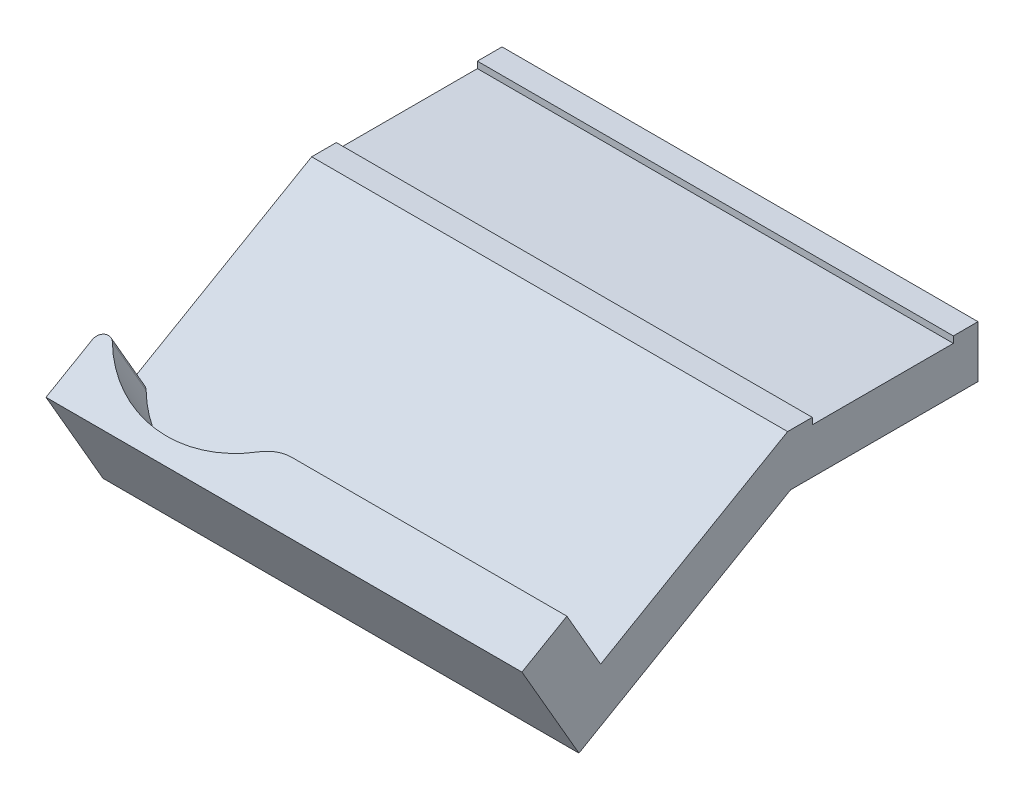
ISO-10303-21;
HEADER;
FILE_DESCRIPTION(('STEP AP214'),'2;1');
FILE_NAME('part.step','',(''),(''),'','','');
FILE_SCHEMA(('AUTOMOTIVE_DESIGN { 1 0 10303 214 1 1 1 1 }'));
ENDSEC;
DATA;
#1=APPLICATION_CONTEXT('core data for automotive mechanical design processes');
#2=APPLICATION_PROTOCOL_DEFINITION('international standard','automotive_design',2000,#1);
#3=PRODUCT_CONTEXT('',#1,'mechanical');
#4=PRODUCT('Part','Part','',(#3));
#5=PRODUCT_RELATED_PRODUCT_CATEGORY('part','',(#4));
#6=PRODUCT_DEFINITION_FORMATION('','',#4);
#7=PRODUCT_DEFINITION_CONTEXT('part definition',#1,'design');
#8=PRODUCT_DEFINITION('design','',#6,#7);
#9=PRODUCT_DEFINITION_SHAPE('','',#8);
#10=(LENGTH_UNIT() NAMED_UNIT(*) SI_UNIT(.MILLI.,.METRE.));
#11=(NAMED_UNIT(*) PLANE_ANGLE_UNIT() SI_UNIT($,.RADIAN.));
#12=(NAMED_UNIT(*) SI_UNIT($,.STERADIAN.) SOLID_ANGLE_UNIT());
#13=UNCERTAINTY_MEASURE_WITH_UNIT(LENGTH_MEASURE(1.E-05),#10,'distance_accuracy_value','');
#14=(GEOMETRIC_REPRESENTATION_CONTEXT(3) GLOBAL_UNCERTAINTY_ASSIGNED_CONTEXT((#13)) GLOBAL_UNIT_ASSIGNED_CONTEXT((#10,
#11,#12)) REPRESENTATION_CONTEXT('',''));
#15=CARTESIAN_POINT('',(0.,0.,0.));
#16=DIRECTION('',(0.,0.,1.));
#17=DIRECTION('',(1.,0.,0.));
#18=AXIS2_PLACEMENT_3D('',#15,#16,#17);
#19=CARTESIAN_POINT('',(55.,23.2790561913612,-51.4));
#20=DIRECTION('',(0.,-1.,0.));
#21=DIRECTION('',(0.,0.,-1.));
#22=AXIS2_PLACEMENT_3D('',#19,#20,#21);
#23=PLANE('',#22);
#24=DIRECTION('',(0.,0.,1.));
#25=VECTOR('',#24,1.);
#26=CARTESIAN_POINT('',(0.,23.2790561913612,-51.4));
#27=LINE('',#26,#25);
#28=CARTESIAN_POINT('',(0.,23.2790561913612,-51.4));
#29=VERTEX_POINT('',#28);
#30=CARTESIAN_POINT('',(0.,23.2790561913612,-48.55));
#31=VERTEX_POINT('',#30);
#32=EDGE_CURVE('E217',#29,#31,#27,.T.);
#33=ORIENTED_EDGE('',*,*,#32,.T.);
#34=DIRECTION('',(-1.,0.,0.));
#35=VECTOR('',#34,1.);
#36=CARTESIAN_POINT('',(0.,23.2790561913612,-48.55));
#37=LINE('',#36,#35);
#38=CARTESIAN_POINT('',(55.,23.2790561913612,-48.55));
#39=VERTEX_POINT('',#38);
#40=EDGE_CURVE('E181',#39,#31,#37,.T.);
#41=ORIENTED_EDGE('',*,*,#40,.F.);
#42=DIRECTION('',(0.,0.,1.));
#43=VECTOR('',#42,1.);
#44=CARTESIAN_POINT('',(55.,23.2790561913612,-51.4));
#45=LINE('',#44,#43);
#46=CARTESIAN_POINT('',(55.,23.2790561913612,-51.4));
#47=VERTEX_POINT('',#46);
#48=EDGE_CURVE('E213',#47,#39,#45,.T.);
#49=ORIENTED_EDGE('',*,*,#48,.F.);
#50=DIRECTION('',(1.,0.,0.));
#51=VECTOR('',#50,1.);
#52=CARTESIAN_POINT('',(55.,23.2790561913612,-51.4));
#53=LINE('',#52,#51);
#54=EDGE_CURVE('E210',#29,#47,#53,.T.);
#55=ORIENTED_EDGE('',*,*,#54,.F.);
#56=EDGE_LOOP('',(#33,#41,#49,#55));
#57=FACE_BOUND('',#56,.T.);
#58=ADVANCED_FACE('F35',(#57),#23,.F.);
#59=CARTESIAN_POINT('',(0.,50.,-33.9));
#60=DIRECTION('',(1.,0.,0.));
#61=DIRECTION('',(0.,0.,-1.));
#62=AXIS2_PLACEMENT_3D('',#59,#60,#61);
#63=PLANE('',#62);
#64=DIRECTION('',(0.,0.,1.));
#65=VECTOR('',#64,1.);
#66=CARTESIAN_POINT('',(0.,22.5290561913612,-48.55));
#67=LINE('',#66,#65);
#68=CARTESIAN_POINT('',(0.,22.5290561913612,-48.55));
#69=VERTEX_POINT('',#68);
#70=CARTESIAN_POINT('',(0.,22.5290561913612,-32.25));
#71=VERTEX_POINT('',#70);
#72=EDGE_CURVE('E177',#69,#71,#67,.T.);
#73=ORIENTED_EDGE('',*,*,#72,.F.);
#74=DIRECTION('',(0.,1.,0.));
#75=VECTOR('',#74,1.);
#76=CARTESIAN_POINT('',(0.,22.5290561913612,-48.55));
#77=LINE('',#76,#75);
#78=EDGE_CURVE('E191',#69,#31,#77,.T.);
#79=ORIENTED_EDGE('',*,*,#78,.T.);
#80=ORIENTED_EDGE('',*,*,#32,.F.);
#81=DIRECTION('',(0.,1.,0.));
#82=VECTOR('',#81,1.);
#83=CARTESIAN_POINT('',(0.,23.2790561913612,-51.4));
#84=LINE('',#83,#82);
#85=CARTESIAN_POINT('',(0.,17.2790561913612,-51.4));
#86=VERTEX_POINT('',#85);
#87=EDGE_CURVE('E208',#86,#29,#84,.T.);
#88=ORIENTED_EDGE('',*,*,#87,.F.);
#89=DIRECTION('',(0.,0.,1.));
#90=VECTOR('',#89,1.);
#91=CARTESIAN_POINT('',(0.,17.2790561913612,-51.4));
#92=LINE('',#91,#90);
#93=CARTESIAN_POINT('',(0.,17.2790561913612,-29.7464101615138));
#94=VERTEX_POINT('',#93);
#95=EDGE_CURVE('E220',#86,#94,#92,.T.);
#96=ORIENTED_EDGE('',*,*,#95,.T.);
#97=DIRECTION('',(0.,-0.5,0.866025403784438));
#98=VECTOR('',#97,1.);
#99=CARTESIAN_POINT('',(0.,17.0790561913612,-29.4));
#100=LINE('',#99,#98);
#101=CARTESIAN_POINT('',(0.,3.15662432702582,-5.28564064605523));
#102=VERTEX_POINT('',#101);
#103=EDGE_CURVE('E221',#94,#102,#100,.T.);
#104=ORIENTED_EDGE('',*,*,#103,.T.);
#105=DIRECTION('',(0.,0.866025403784439,0.5));
#106=VECTOR('',#105,1.);
#107=CARTESIAN_POINT('',(0.,14.5616224765447,1.29903810567667));
#108=LINE('',#107,#106);
#109=CARTESIAN_POINT('',(0.,14.5616224765447,1.29903810567667));
#110=VERTEX_POINT('',#109);
#111=EDGE_CURVE('E173',#102,#110,#108,.T.);
#112=ORIENTED_EDGE('',*,*,#111,.T.);
#113=DIRECTION('',(0.,0.500000000000001,-0.866025403784438));
#114=VECTOR('',#113,1.);
#115=CARTESIAN_POINT('',(0.,11.7549981495187,6.16025403784437));
#116=LINE('',#115,#114);
#117=CARTESIAN_POINT('',(0.,17.6483114747863,-4.04726406644169));
#118=VERTEX_POINT('',#117);
#119=EDGE_CURVE('E156',#110,#118,#116,.T.);
#120=ORIENTED_EDGE('',*,*,#119,.T.);
#121=DIRECTION('',(0.,0.866025403784442,0.499999999999995));
#122=VECTOR('',#121,1.);
#123=CARTESIAN_POINT('',(0.,10.8933133252676,-7.94726406644171));
#124=LINE('',#123,#122);
#125=CARTESIAN_POINT('',(0.,10.8933133252675,-7.9472640664417));
#126=VERTEX_POINT('',#125);
#127=EDGE_CURVE('E248',#118,#126,#124,.F.);
#128=ORIENTED_EDGE('',*,*,#127,.T.);
#129=DIRECTION('',(0.,-0.499999999999995,0.866025403784442));
#130=VECTOR('',#129,1.);
#131=CARTESIAN_POINT('',(0.,31.9078493020357,-44.3455080756888));
#132=LINE('',#131,#130);
#133=CARTESIAN_POINT('',(0.,23.2790561913612,-29.4));
#134=VERTEX_POINT('',#133);
#135=EDGE_CURVE('E231',#134,#126,#132,.T.);
#136=ORIENTED_EDGE('',*,*,#135,.F.);
#137=CARTESIAN_POINT('',(0.,23.2790561913612,-32.25));
#138=VERTEX_POINT('',#137);
#139=EDGE_CURVE('E216',#138,#134,#27,.T.);
#140=ORIENTED_EDGE('',*,*,#139,.F.);
#141=DIRECTION('',(0.,1.,0.));
#142=VECTOR('',#141,1.);
#143=CARTESIAN_POINT('',(0.,22.5290561913612,-32.25));
#144=LINE('',#143,#142);
#145=EDGE_CURVE('E52',#71,#138,#144,.T.);
#146=ORIENTED_EDGE('',*,*,#145,.F.);
#147=EDGE_LOOP('',(#73,#79,#80,#88,#96,#104,#112,#120,#128,#136,#140,#146));
#148=FACE_BOUND('',#147,.T.);
#149=ADVANCED_FACE('F273',(#148),#63,.F.);
#150=CARTESIAN_POINT('',(55.,50.,-33.9));
#151=DIRECTION('',(1.,0.,0.));
#152=DIRECTION('',(0.,0.,-1.));
#153=AXIS2_PLACEMENT_3D('',#150,#151,#152);
#154=PLANE('',#153);
#155=DIRECTION('',(0.,1.,0.));
#156=VECTOR('',#155,1.);
#157=CARTESIAN_POINT('',(55.,22.5290561913612,-48.55));
#158=LINE('',#157,#156);
#159=CARTESIAN_POINT('',(55.,22.5290561913612,-48.55));
#160=VERTEX_POINT('',#159);
#161=EDGE_CURVE('E195',#160,#39,#158,.T.);
#162=ORIENTED_EDGE('',*,*,#161,.F.);
#163=DIRECTION('',(0.,0.,-1.));
#164=VECTOR('',#163,1.);
#165=CARTESIAN_POINT('',(55.,22.5290561913612,-48.55));
#166=LINE('',#165,#164);
#167=CARTESIAN_POINT('',(55.,22.5290561913612,-32.25));
#168=VERTEX_POINT('',#167);
#169=EDGE_CURVE('E184',#168,#160,#166,.T.);
#170=ORIENTED_EDGE('',*,*,#169,.F.);
#171=DIRECTION('',(0.,1.,0.));
#172=VECTOR('',#171,1.);
#173=CARTESIAN_POINT('',(55.,22.5290561913612,-32.25));
#174=LINE('',#173,#172);
#175=CARTESIAN_POINT('',(55.,23.2790561913612,-32.25));
#176=VERTEX_POINT('',#175);
#177=EDGE_CURVE('E197',#168,#176,#174,.T.);
#178=ORIENTED_EDGE('',*,*,#177,.T.);
#179=CARTESIAN_POINT('',(55.,23.2790561913612,-29.4));
#180=VERTEX_POINT('',#179);
#181=EDGE_CURVE('E212',#176,#180,#45,.T.);
#182=ORIENTED_EDGE('',*,*,#181,.T.);
#183=DIRECTION('',(0.,0.499999999999995,-0.866025403784441));
#184=VECTOR('',#183,1.);
#185=CARTESIAN_POINT('',(55.,10.,-6.4));
#186=LINE('',#185,#184);
#187=CARTESIAN_POINT('',(55.,10.805,-7.79430090009301));
#188=VERTEX_POINT('',#187);
#189=EDGE_CURVE('E239',#188,#180,#186,.T.);
#190=ORIENTED_EDGE('',*,*,#189,.F.);
#191=DIRECTION('',(0.,0.866025403784439,0.5));
#192=VECTOR('',#191,1.);
#193=CARTESIAN_POINT('',(55.,10.805,-7.79430090009301));
#194=LINE('',#193,#192);
#195=CARTESIAN_POINT('',(55.,17.5599981495188,-3.89430090009295));
#196=VERTEX_POINT('',#195);
#197=EDGE_CURVE('E153',#188,#196,#194,.T.);
#198=ORIENTED_EDGE('',*,*,#197,.T.);
#199=DIRECTION('',(0.,0.500000000000001,-0.866025403784438));
#200=VECTOR('',#199,1.);
#201=CARTESIAN_POINT('',(55.,11.7549981495187,6.16025403784437));
#202=LINE('',#201,#200);
#203=CARTESIAN_POINT('',(55.,14.5616224765447,1.29903810567666));
#204=VERTEX_POINT('',#203);
#205=EDGE_CURVE('E145',#204,#196,#202,.T.);
#206=ORIENTED_EDGE('',*,*,#205,.F.);
#207=DIRECTION('',(0.,-0.866025403784439,-0.5));
#208=VECTOR('',#207,1.);
#209=CARTESIAN_POINT('',(55.,14.5616224765447,1.29903810567666));
#210=LINE('',#209,#208);
#211=CARTESIAN_POINT('',(55.,3.15662432702582,-5.28564064605524));
#212=VERTEX_POINT('',#211);
#213=EDGE_CURVE('E150',#204,#212,#210,.T.);
#214=ORIENTED_EDGE('',*,*,#213,.T.);
#215=DIRECTION('',(0.,-0.5,0.866025403784438));
#216=VECTOR('',#215,1.);
#217=CARTESIAN_POINT('',(55.,17.0790561913612,-29.4));
#218=LINE('',#217,#216);
#219=CARTESIAN_POINT('',(55.,17.2790561913612,-29.7464101615138));
#220=VERTEX_POINT('',#219);
#221=EDGE_CURVE('E224',#220,#212,#218,.T.);
#222=ORIENTED_EDGE('',*,*,#221,.F.);
#223=DIRECTION('',(0.,0.,1.));
#224=VECTOR('',#223,1.);
#225=CARTESIAN_POINT('',(55.,17.2790561913612,-51.4));
#226=LINE('',#225,#224);
#227=CARTESIAN_POINT('',(55.,17.2790561913612,-51.4));
#228=VERTEX_POINT('',#227);
#229=EDGE_CURVE('E226',#228,#220,#226,.T.);
#230=ORIENTED_EDGE('',*,*,#229,.F.);
#231=DIRECTION('',(0.,-1.,0.));
#232=VECTOR('',#231,1.);
#233=CARTESIAN_POINT('',(55.,23.2790561913612,-51.4));
#234=LINE('',#233,#232);
#235=EDGE_CURVE('E203',#47,#228,#234,.T.);
#236=ORIENTED_EDGE('',*,*,#235,.F.);
#237=ORIENTED_EDGE('',*,*,#48,.T.);
#238=EDGE_LOOP('',(#162,#170,#178,#182,#190,#198,#206,#214,#222,#230,#236,#237));
#239=FACE_BOUND('',#238,.T.);
#240=ADVANCED_FACE('F148',(#239),#154,.T.);
#241=CARTESIAN_POINT('',(5.,10.,-6.4));
#242=DIRECTION('',(0.,-0.866025403784442,-0.499999999999995));
#243=DIRECTION('',(0.,0.499999999999995,-0.866025403784442));
#244=AXIS2_PLACEMENT_3D('',#241,#242,#243);
#245=PLANE('',#244);
#246=ORIENTED_EDGE('',*,*,#189,.T.);
#247=DIRECTION('',(1.,0.,0.));
#248=VECTOR('',#247,1.);
#249=CARTESIAN_POINT('',(0.,23.2790561913612,-29.4));
#250=LINE('',#249,#248);
#251=EDGE_CURVE('E223',#134,#180,#250,.T.);
#252=ORIENTED_EDGE('',*,*,#251,.F.);
#253=ORIENTED_EDGE('',*,*,#135,.T.);
#254=CARTESIAN_POINT('',(1.,10.8933133252676,-7.94726406644171));
#255=DIRECTION('',(0.,-0.866025403784442,-0.499999999999995));
#256=DIRECTION('',(0.,0.499999999999995,-0.866025403784442));
#257=AXIS2_PLACEMENT_3D('',#254,#255,#256);
#258=CIRCLE('',#257,1.);
#259=CARTESIAN_POINT('',(1.7457627118644,11.2264191558952,-8.5242202893863));
#260=VERTEX_POINT('',#259);
#261=EDGE_CURVE('E251',#126,#260,#258,.T.);
#262=ORIENTED_EDGE('',*,*,#261,.T.);
#263=CARTESIAN_POINT('',(12.,15.8066243270259,-16.4573683548744));
#264=DIRECTION('',(0.,0.866025403784442,0.499999999999995));
#265=DIRECTION('',(0.,-0.499999999999995,0.866025403784442));
#266=AXIS2_PLACEMENT_3D('',#263,#264,#265);
#267=CIRCLE('',#266,13.75);
#268=CARTESIAN_POINT('',(20.2468225824083,10.3054331538735,-6.92902574082495));
#269=VERTEX_POINT('',#268);
#270=EDGE_CURVE('E229',#260,#269,#267,.T.);
#271=ORIENTED_EDGE('',*,*,#270,.T.);
#272=CARTESIAN_POINT('',(23.2456671578295,8.30499999999994,-3.46417388117061));
#273=DIRECTION('',(0.,-0.866025403784442,-0.499999999999995));
#274=DIRECTION('',(0.,0.499999999999995,-0.866025403784442));
#275=AXIS2_PLACEMENT_3D('',#272,#273,#274);
#276=CIRCLE('',#275,5.);
#277=CARTESIAN_POINT('',(23.2456671578295,10.805,-7.79430090009301));
#278=VERTEX_POINT('',#277);
#279=EDGE_CURVE('E11',#269,#278,#276,.T.);
#280=ORIENTED_EDGE('',*,*,#279,.T.);
#281=DIRECTION('',(1.,0.,0.));
#282=VECTOR('',#281,1.);
#283=CARTESIAN_POINT('',(0.,10.805,-7.79430090009301));
#284=LINE('',#283,#282);
#285=EDGE_CURVE('E236',#278,#188,#284,.T.);
#286=ORIENTED_EDGE('',*,*,#285,.T.);
#287=EDGE_LOOP('',(#246,#252,#253,#262,#271,#280,#286));
#288=FACE_BOUND('',#287,.T.);
#289=ADVANCED_FACE('F295',(#288),#245,.F.);
#290=CARTESIAN_POINT('',(0.,10.805,-7.79430090009301));
#291=DIRECTION('',(0.,0.5,-0.866025403784439));
#292=DIRECTION('',(0.,0.866025403784439,0.5));
#293=AXIS2_PLACEMENT_3D('',#290,#291,#292);
#294=PLANE('',#293);
#295=ORIENTED_EDGE('',*,*,#285,.F.);
#296=DIRECTION('',(0.,-0.866025403784439,-0.5));
#297=VECTOR('',#296,1.);
#298=CARTESIAN_POINT('',(23.2456671578295,10.805,-7.79430090009301));
#299=LINE('',#298,#297);
#300=CARTESIAN_POINT('',(23.2456671578295,17.5599981495188,-3.89430090009295));
#301=VERTEX_POINT('',#300);
#302=EDGE_CURVE('E253',#278,#301,#299,.F.);
#303=ORIENTED_EDGE('',*,*,#302,.T.);
#304=DIRECTION('',(1.,0.,0.));
#305=VECTOR('',#304,1.);
#306=CARTESIAN_POINT('',(0.,17.5599981495188,-3.89430090009295));
#307=LINE('',#306,#305);
#308=EDGE_CURVE('E157',#301,#196,#307,.T.);
#309=ORIENTED_EDGE('',*,*,#308,.T.);
#310=ORIENTED_EDGE('',*,*,#197,.F.);
#311=EDGE_LOOP('',(#295,#303,#309,#310));
#312=FACE_BOUND('',#311,.T.);
#313=ADVANCED_FACE('F298',(#312),#294,.T.);
#314=CARTESIAN_POINT('',(0.,11.7549981495187,6.16025403784437));
#315=DIRECTION('',(0.,-0.866025403784438,-0.500000000000001));
#316=DIRECTION('',(0.,0.500000000000001,-0.866025403784438));
#317=AXIS2_PLACEMENT_3D('',#314,#315,#316);
#318=PLANE('',#317);
#319=ORIENTED_EDGE('',*,*,#308,.F.);
#320=CARTESIAN_POINT('',(23.2456671578295,15.0599981495187,0.435826118829394));
#321=DIRECTION('',(0.,-0.866025403784438,-0.500000000000001));
#322=DIRECTION('',(0.,0.500000000000001,-0.866025403784438));
#323=AXIS2_PLACEMENT_3D('',#320,#321,#322);
#324=CIRCLE('',#323,5.);
#325=CARTESIAN_POINT('',(20.2468225824083,17.0604313033923,-3.02902574082494));
#326=VERTEX_POINT('',#325);
#327=EDGE_CURVE('E256',#301,#326,#324,.F.);
#328=ORIENTED_EDGE('',*,*,#327,.T.);
#329=CARTESIAN_POINT('',(12.,22.5616224765447,-12.5573683548744));
#330=DIRECTION('',(0.,-0.866025403784438,-0.500000000000001));
#331=DIRECTION('',(0.,0.500000000000001,-0.866025403784438));
#332=AXIS2_PLACEMENT_3D('',#329,#330,#331);
#333=CIRCLE('',#332,13.75);
#334=CARTESIAN_POINT('',(1.74576271186441,17.981417305414,-4.62422028938628));
#335=VERTEX_POINT('',#334);
#336=EDGE_CURVE('E233',#335,#326,#333,.F.);
#337=ORIENTED_EDGE('',*,*,#336,.F.);
#338=CARTESIAN_POINT('',(1.,17.6483114747863,-4.04726406644169));
#339=DIRECTION('',(0.,-0.866025403784438,-0.500000000000001));
#340=DIRECTION('',(0.,0.500000000000001,-0.866025403784438));
#341=AXIS2_PLACEMENT_3D('',#338,#339,#340);
#342=CIRCLE('',#341,1.);
#343=EDGE_CURVE('E246',#335,#118,#342,.F.);
#344=ORIENTED_EDGE('',*,*,#343,.T.);
#345=ORIENTED_EDGE('',*,*,#119,.F.);
#346=DIRECTION('',(1.,0.,0.));
#347=VECTOR('',#346,1.);
#348=CARTESIAN_POINT('',(-14.4878214891886,14.5616224765447,1.29903810567668));
#349=LINE('',#348,#347);
#350=EDGE_CURVE('E160',#110,#204,#349,.T.);
#351=ORIENTED_EDGE('',*,*,#350,.T.);
#352=ORIENTED_EDGE('',*,*,#205,.T.);
#353=EDGE_LOOP('',(#319,#328,#337,#344,#345,#351,#352));
#354=FACE_BOUND('',#353,.T.);
#355=ADVANCED_FACE('F161',(#354),#318,.F.);
#356=CARTESIAN_POINT('',(12.,48.5779056191363,2.46313972081422));
#357=DIRECTION('',(0.,-0.866025403784442,-0.499999999999995));
#358=DIRECTION('',(0.,0.499999999999995,-0.866025403784442));
#359=AXIS2_PLACEMENT_3D('',#356,#357,#358);
#360=CYLINDRICAL_SURFACE('',#359,13.75);
#361=ORIENTED_EDGE('',*,*,#336,.T.);
#362=DIRECTION('',(0.,-0.866025403784442,-0.499999999999995));
#363=VECTOR('',#362,1.);
#364=CARTESIAN_POINT('',(20.2468225824083,43.0767144459839,11.9914823348637));
#365=LINE('',#364,#363);
#366=EDGE_CURVE('E44',#326,#269,#365,.T.);
#367=ORIENTED_EDGE('',*,*,#366,.T.);
#368=ORIENTED_EDGE('',*,*,#270,.F.);
#369=DIRECTION('',(0.,-0.866025403784442,-0.499999999999995));
#370=VECTOR('',#369,1.);
#371=CARTESIAN_POINT('',(1.74576271186441,43.9977004480056,10.3962877863023));
#372=LINE('',#371,#370);
#373=EDGE_CURVE('E243',#260,#335,#372,.F.);
#374=ORIENTED_EDGE('',*,*,#373,.T.);
#375=EDGE_LOOP('',(#361,#367,#368,#374));
#376=FACE_BOUND('',#375,.T.);
#377=ADVANCED_FACE('F302',(#376),#360,.F.);
#378=CARTESIAN_POINT('',(1.,43.664594617378,10.9732440092469));
#379=DIRECTION('',(0.,-0.866025403784442,-0.499999999999995));
#380=DIRECTION('',(0.,0.499999999999995,-0.866025403784442));
#381=AXIS2_PLACEMENT_3D('',#378,#379,#380);
#382=CYLINDRICAL_SURFACE('',#381,1.);
#383=ORIENTED_EDGE('',*,*,#261,.F.);
#384=ORIENTED_EDGE('',*,*,#127,.F.);
#385=ORIENTED_EDGE('',*,*,#343,.F.);
#386=ORIENTED_EDGE('',*,*,#373,.F.);
#387=EDGE_LOOP('',(#383,#384,#385,#386));
#388=FACE_BOUND('',#387,.T.);
#389=ADVANCED_FACE('F307',(#388),#382,.T.);
#390=CARTESIAN_POINT('',(23.2456671578295,41.0762812921103,15.456334194518));
#391=DIRECTION('',(0.,-0.866025403784442,-0.499999999999995));
#392=DIRECTION('',(0.,0.499999999999995,-0.866025403784442));
#393=AXIS2_PLACEMENT_3D('',#390,#391,#392);
#394=CYLINDRICAL_SURFACE('',#393,5.);
#395=ORIENTED_EDGE('',*,*,#279,.F.);
#396=ORIENTED_EDGE('',*,*,#366,.F.);
#397=ORIENTED_EDGE('',*,*,#327,.F.);
#398=ORIENTED_EDGE('',*,*,#302,.F.);
#399=EDGE_LOOP('',(#395,#396,#397,#398));
#400=FACE_BOUND('',#399,.T.);
#401=ADVANCED_FACE('F37',(#400),#394,.T.);
#402=CARTESIAN_POINT('',(0.,17.0790561913612,-29.4));
#403=DIRECTION('',(0.,0.866025403784438,0.5));
#404=DIRECTION('',(0.,-0.5,0.866025403784438));
#405=AXIS2_PLACEMENT_3D('',#402,#403,#404);
#406=PLANE('',#405);
#407=ORIENTED_EDGE('',*,*,#221,.T.);
#408=DIRECTION('',(1.,0.,0.));
#409=VECTOR('',#408,1.);
#410=CARTESIAN_POINT('',(-14.4878214891886,3.15662432702582,-5.28564064605522));
#411=LINE('',#410,#409);
#412=EDGE_CURVE('E166',#102,#212,#411,.T.);
#413=ORIENTED_EDGE('',*,*,#412,.F.);
#414=ORIENTED_EDGE('',*,*,#103,.F.);
#415=DIRECTION('',(-1.,0.,0.));
#416=VECTOR('',#415,1.);
#417=CARTESIAN_POINT('',(55.,17.2790561913612,-29.7464101615138));
#418=LINE('',#417,#416);
#419=EDGE_CURVE('E194',#220,#94,#418,.T.);
#420=ORIENTED_EDGE('',*,*,#419,.F.);
#421=EDGE_LOOP('',(#407,#413,#414,#420));
#422=FACE_BOUND('',#421,.T.);
#423=ADVANCED_FACE('F270',(#422),#406,.F.);
#424=CARTESIAN_POINT('',(55.,17.2790561913612,-51.4));
#425=DIRECTION('',(0.,1.,0.));
#426=DIRECTION('',(0.,0.,1.));
#427=AXIS2_PLACEMENT_3D('',#424,#425,#426);
#428=PLANE('',#427);
#429=ORIENTED_EDGE('',*,*,#229,.T.);
#430=ORIENTED_EDGE('',*,*,#419,.T.);
#431=ORIENTED_EDGE('',*,*,#95,.F.);
#432=DIRECTION('',(-1.,0.,0.));
#433=VECTOR('',#432,1.);
#434=CARTESIAN_POINT('',(55.,17.2790561913612,-51.4));
#435=LINE('',#434,#433);
#436=EDGE_CURVE('E206',#228,#86,#435,.T.);
#437=ORIENTED_EDGE('',*,*,#436,.F.);
#438=EDGE_LOOP('',(#429,#430,#431,#437));
#439=FACE_BOUND('',#438,.T.);
#440=ADVANCED_FACE('F265',(#439),#428,.F.);
#441=ORIENTED_EDGE('',*,*,#181,.F.);
#442=DIRECTION('',(1.,0.,0.));
#443=VECTOR('',#442,1.);
#444=CARTESIAN_POINT('',(0.,23.2790561913612,-32.25));
#445=LINE('',#444,#443);
#446=EDGE_CURVE('E176',#138,#176,#445,.T.);
#447=ORIENTED_EDGE('',*,*,#446,.F.);
#448=ORIENTED_EDGE('',*,*,#139,.T.);
#449=ORIENTED_EDGE('',*,*,#251,.T.);
#450=EDGE_LOOP('',(#441,#447,#448,#449));
#451=FACE_BOUND('',#450,.T.);
#452=ADVANCED_FACE('F293',(#451),#23,.F.);
#453=CARTESIAN_POINT('',(0.,0.,-51.4));
#454=DIRECTION('',(0.,0.,-1.));
#455=DIRECTION('',(-1.,0.,0.));
#456=AXIS2_PLACEMENT_3D('',#453,#454,#455);
#457=PLANE('',#456);
#458=ORIENTED_EDGE('',*,*,#235,.T.);
#459=ORIENTED_EDGE('',*,*,#436,.T.);
#460=ORIENTED_EDGE('',*,*,#87,.T.);
#461=ORIENTED_EDGE('',*,*,#54,.T.);
#462=EDGE_LOOP('',(#458,#459,#460,#461));
#463=FACE_BOUND('',#462,.T.);
#464=ADVANCED_FACE('F278',(#463),#457,.T.);
#465=CARTESIAN_POINT('',(0.,22.5290561913612,-48.55));
#466=DIRECTION('',(0.,0.,-1.));
#467=DIRECTION('',(-1.,0.,0.));
#468=AXIS2_PLACEMENT_3D('',#465,#466,#467);
#469=PLANE('',#468);
#470=ORIENTED_EDGE('',*,*,#40,.T.);
#471=ORIENTED_EDGE('',*,*,#78,.F.);
#472=DIRECTION('',(-1.,0.,0.));
#473=VECTOR('',#472,1.);
#474=CARTESIAN_POINT('',(0.,22.5290561913612,-48.55));
#475=LINE('',#474,#473);
#476=EDGE_CURVE('E186',#160,#69,#475,.T.);
#477=ORIENTED_EDGE('',*,*,#476,.F.);
#478=ORIENTED_EDGE('',*,*,#161,.T.);
#479=EDGE_LOOP('',(#470,#471,#477,#478));
#480=FACE_BOUND('',#479,.T.);
#481=ADVANCED_FACE('F285',(#480),#469,.F.);
#482=CARTESIAN_POINT('',(0.,22.5290561913612,-32.25));
#483=DIRECTION('',(0.,0.,1.));
#484=DIRECTION('',(1.,0.,0.));
#485=AXIS2_PLACEMENT_3D('',#482,#483,#484);
#486=PLANE('',#485);
#487=ORIENTED_EDGE('',*,*,#446,.T.);
#488=ORIENTED_EDGE('',*,*,#177,.F.);
#489=DIRECTION('',(1.,0.,0.));
#490=VECTOR('',#489,1.);
#491=CARTESIAN_POINT('',(0.,22.5290561913612,-32.25));
#492=LINE('',#491,#490);
#493=EDGE_CURVE('E180',#71,#168,#492,.T.);
#494=ORIENTED_EDGE('',*,*,#493,.F.);
#495=ORIENTED_EDGE('',*,*,#145,.T.);
#496=EDGE_LOOP('',(#487,#488,#494,#495));
#497=FACE_BOUND('',#496,.T.);
#498=ADVANCED_FACE('F386',(#497),#486,.F.);
#499=CARTESIAN_POINT('',(0.,22.5290561913612,0.));
#500=DIRECTION('',(0.,1.,0.));
#501=DIRECTION('',(0.,0.,1.));
#502=AXIS2_PLACEMENT_3D('',#499,#500,#501);
#503=PLANE('',#502);
#504=ORIENTED_EDGE('',*,*,#72,.T.);
#505=ORIENTED_EDGE('',*,*,#493,.T.);
#506=ORIENTED_EDGE('',*,*,#169,.T.);
#507=ORIENTED_EDGE('',*,*,#476,.T.);
#508=EDGE_LOOP('',(#504,#505,#506,#507));
#509=FACE_BOUND('',#508,.T.);
#510=ADVANCED_FACE('F287',(#509),#503,.T.);
#511=CARTESIAN_POINT('',(-14.4878214891886,14.5616224765447,1.29903810567668));
#512=DIRECTION('',(0.,-0.5,0.866025403784439));
#513=DIRECTION('',(0.,-0.866025403784439,-0.5));
#514=AXIS2_PLACEMENT_3D('',#511,#512,#513);
#515=PLANE('',#514);
#516=ORIENTED_EDGE('',*,*,#111,.F.);
#517=ORIENTED_EDGE('',*,*,#412,.T.);
#518=ORIENTED_EDGE('',*,*,#213,.F.);
#519=ORIENTED_EDGE('',*,*,#350,.F.);
#520=EDGE_LOOP('',(#516,#517,#518,#519));
#521=FACE_BOUND('',#520,.T.);
#522=ADVANCED_FACE('F169',(#521),#515,.T.);
#523=CLOSED_SHELL('',(#58,#149,#240,#289,#313,#355,#377,#389,#401,#423,#440,#452,#464,#481,#498,
#510,#522));
#524=MANIFOLD_SOLID_BREP('B2',#523);
#525=ADVANCED_BREP_SHAPE_REPRESENTATION('',(#18,#524),#14);
#526=SHAPE_DEFINITION_REPRESENTATION(#9,#525);
ENDSEC;
END-ISO-10303-21;
